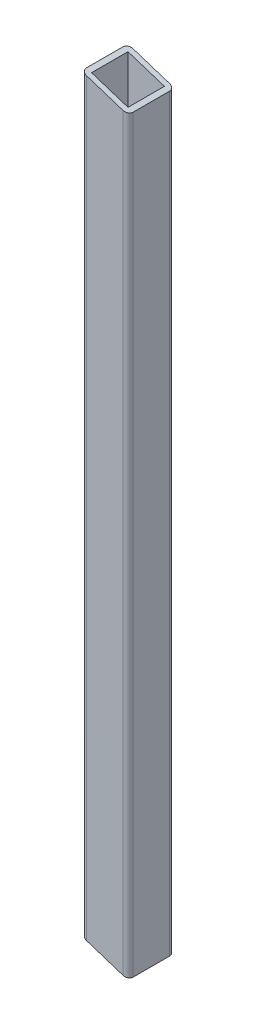
ISO-10303-21;
HEADER;
FILE_DESCRIPTION(('STEP AP214'),'2;1');
FILE_NAME('part.step','',(''),(''),'','','');
FILE_SCHEMA(('AUTOMOTIVE_DESIGN { 1 0 10303 214 1 1 1 1 }'));
ENDSEC;
DATA;
#1=APPLICATION_CONTEXT('core data for automotive mechanical design processes');
#2=APPLICATION_PROTOCOL_DEFINITION('international standard','automotive_design',2000,#1);
#3=PRODUCT_CONTEXT('',#1,'mechanical');
#4=PRODUCT('Part','Part','',(#3));
#5=PRODUCT_RELATED_PRODUCT_CATEGORY('part','',(#4));
#6=PRODUCT_DEFINITION_FORMATION('','',#4);
#7=PRODUCT_DEFINITION_CONTEXT('part definition',#1,'design');
#8=PRODUCT_DEFINITION('design','',#6,#7);
#9=PRODUCT_DEFINITION_SHAPE('','',#8);
#10=(LENGTH_UNIT() NAMED_UNIT(*) SI_UNIT(.MILLI.,.METRE.));
#11=(NAMED_UNIT(*) PLANE_ANGLE_UNIT() SI_UNIT($,.RADIAN.));
#12=(NAMED_UNIT(*) SI_UNIT($,.STERADIAN.) SOLID_ANGLE_UNIT());
#13=UNCERTAINTY_MEASURE_WITH_UNIT(LENGTH_MEASURE(1.E-05),#10,'distance_accuracy_value','');
#14=(GEOMETRIC_REPRESENTATION_CONTEXT(3) GLOBAL_UNCERTAINTY_ASSIGNED_CONTEXT((#13)) GLOBAL_UNIT_ASSIGNED_CONTEXT((#10,
#11,#12)) REPRESENTATION_CONTEXT('',''));
#15=CARTESIAN_POINT('',(0.,0.,0.));
#16=DIRECTION('',(0.,0.,1.));
#17=DIRECTION('',(1.,0.,0.));
#18=AXIS2_PLACEMENT_3D('',#15,#16,#17);
#19=CARTESIAN_POINT('',(22.8,420.,2.8));
#20=DIRECTION('',(0.,-1.,0.));
#21=DIRECTION('',(0.,0.,-1.));
#22=AXIS2_PLACEMENT_3D('',#19,#20,#21);
#23=CYLINDRICAL_SURFACE('',#22,2.8);
#24=CARTESIAN_POINT('',(22.8,412.59183092589,2.8));
#25=DIRECTION('',(0.309016994374948,0.951056516295153,0.));
#26=DIRECTION('',(0.951056516295154,-0.309016994374948,0.));
#27=AXIS2_PLACEMENT_3D('',#24,#25,#26);
#28=ELLIPSE('',#27,2.94409422786715,2.8);
#29=CARTESIAN_POINT('',(25.6,411.682055776438,2.80000000000002));
#30=VERTEX_POINT('',#29);
#31=CARTESIAN_POINT('',(22.8,412.59183092589,0.));
#32=VERTEX_POINT('',#31);
#33=EDGE_CURVE('E209',#30,#32,#28,.T.);
#34=ORIENTED_EDGE('',*,*,#33,.F.);
#35=DIRECTION('',(0.,-1.,0.));
#36=VECTOR('',#35,1.);
#37=CARTESIAN_POINT('',(25.6,420.,2.80000000000002));
#38=LINE('',#37,#36);
#39=CARTESIAN_POINT('',(25.6,0.,2.80000000000002));
#40=VERTEX_POINT('',#39);
#41=EDGE_CURVE('E145',#30,#40,#38,.T.);
#42=ORIENTED_EDGE('',*,*,#41,.T.);
#43=CARTESIAN_POINT('',(22.8,0.909775149452119,2.8));
#44=DIRECTION('',(-0.30901699437494,-0.951056516295156,0.));
#45=DIRECTION('',(0.951056516295156,-0.30901699437494,0.));
#46=AXIS2_PLACEMENT_3D('',#43,#44,#45);
#47=ELLIPSE('',#46,2.94409422786714,2.8);
#48=CARTESIAN_POINT('',(22.8,0.909775149452188,0.));
#49=VERTEX_POINT('',#48);
#50=EDGE_CURVE('E175',#49,#40,#47,.T.);
#51=ORIENTED_EDGE('',*,*,#50,.F.);
#52=DIRECTION('',(0.,-1.,0.));
#53=VECTOR('',#52,1.);
#54=CARTESIAN_POINT('',(22.8,420.,0.));
#55=LINE('',#54,#53);
#56=EDGE_CURVE('E41',#32,#49,#55,.T.);
#57=ORIENTED_EDGE('',*,*,#56,.F.);
#58=EDGE_LOOP('',(#34,#42,#51,#57));
#59=FACE_BOUND('',#58,.T.);
#60=ADVANCED_FACE('F34',(#59),#23,.T.);
#61=CARTESIAN_POINT('',(2.80000000000002,420.,0.));
#62=DIRECTION('',(0.,0.,1.));
#63=DIRECTION('',(1.,0.,0.));
#64=AXIS2_PLACEMENT_3D('',#61,#62,#63);
#65=PLANE('',#64);
#66=DIRECTION('',(-0.951056516295154,0.309016994374948,0.));
#67=VECTOR('',#66,1.);
#68=CARTESIAN_POINT('',(2.53262379212494,419.177100646791,0.));
#69=LINE('',#68,#67);
#70=CARTESIAN_POINT('',(2.80000000000002,419.090224850548,0.));
#71=VERTEX_POINT('',#70);
#72=EDGE_CURVE('E48',#32,#71,#69,.T.);
#73=ORIENTED_EDGE('',*,*,#72,.F.);
#74=ORIENTED_EDGE('',*,*,#56,.T.);
#75=DIRECTION('',(0.951056516295156,-0.30901699437494,0.));
#76=VECTOR('',#75,1.);
#77=CARTESIAN_POINT('',(-118.457696717291,46.8071830573933,0.));
#78=LINE('',#77,#76);
#79=CARTESIAN_POINT('',(2.80000000000002,7.40816907411007,0.));
#80=VERTEX_POINT('',#79);
#81=EDGE_CURVE('E166',#80,#49,#78,.T.);
#82=ORIENTED_EDGE('',*,*,#81,.F.);
#83=DIRECTION('',(0.,-1.,0.));
#84=VECTOR('',#83,1.);
#85=CARTESIAN_POINT('',(2.80000000000002,420.,0.));
#86=LINE('',#85,#84);
#87=EDGE_CURVE('E162',#71,#80,#86,.T.);
#88=ORIENTED_EDGE('',*,*,#87,.F.);
#89=EDGE_LOOP('',(#73,#74,#82,#88));
#90=FACE_BOUND('',#89,.T.);
#91=ADVANCED_FACE('F165',(#90),#65,.F.);
#92=CARTESIAN_POINT('',(2.8,420.,2.8));
#93=DIRECTION('',(0.,-1.,0.));
#94=DIRECTION('',(0.,0.,-1.));
#95=AXIS2_PLACEMENT_3D('',#92,#93,#94);
#96=CYLINDRICAL_SURFACE('',#95,2.8);
#97=CARTESIAN_POINT('',(2.8,419.090224850548,2.8));
#98=DIRECTION('',(0.309016994374948,0.951056516295153,0.));
#99=DIRECTION('',(0.951056516295154,-0.309016994374948,0.));
#100=AXIS2_PLACEMENT_3D('',#97,#98,#99);
#101=ELLIPSE('',#100,2.94409422786715,2.8);
#102=CARTESIAN_POINT('',(0.,420.,2.80000000000002));
#103=VERTEX_POINT('',#102);
#104=EDGE_CURVE('E56',#71,#103,#101,.T.);
#105=ORIENTED_EDGE('',*,*,#104,.F.);
#106=ORIENTED_EDGE('',*,*,#87,.T.);
#107=CARTESIAN_POINT('',(2.8,7.40816907411007,2.8));
#108=DIRECTION('',(-0.30901699437494,-0.951056516295156,0.));
#109=DIRECTION('',(0.951056516295156,-0.30901699437494,0.));
#110=AXIS2_PLACEMENT_3D('',#107,#108,#109);
#111=ELLIPSE('',#110,2.94409422786714,2.8);
#112=CARTESIAN_POINT('',(0.,8.31794422356219,2.80000000000002));
#113=VERTEX_POINT('',#112);
#114=EDGE_CURVE('E177',#113,#80,#111,.T.);
#115=ORIENTED_EDGE('',*,*,#114,.F.);
#116=DIRECTION('',(0.,-1.,0.));
#117=VECTOR('',#116,1.);
#118=CARTESIAN_POINT('',(0.,420.,2.80000000000002));
#119=LINE('',#118,#117);
#120=EDGE_CURVE('E132',#103,#113,#119,.T.);
#121=ORIENTED_EDGE('',*,*,#120,.F.);
#122=EDGE_LOOP('',(#105,#106,#115,#121));
#123=FACE_BOUND('',#122,.T.);
#124=ADVANCED_FACE('F256',(#123),#96,.T.);
#125=CARTESIAN_POINT('',(2.8,420.,22.8));
#126=DIRECTION('',(0.,-1.,0.));
#127=DIRECTION('',(0.,0.,-1.));
#128=AXIS2_PLACEMENT_3D('',#125,#126,#127);
#129=CYLINDRICAL_SURFACE('',#128,2.8);
#130=CARTESIAN_POINT('',(2.8,419.090224850548,22.8));
#131=DIRECTION('',(0.309016994374948,0.951056516295153,0.));
#132=DIRECTION('',(0.951056516295154,-0.309016994374948,0.));
#133=AXIS2_PLACEMENT_3D('',#130,#131,#132);
#134=ELLIPSE('',#133,2.94409422786715,2.8);
#135=CARTESIAN_POINT('',(0.,420.,22.7999999999999));
#136=VERTEX_POINT('',#135);
#137=CARTESIAN_POINT('',(2.80000000000002,419.090224850548,25.6));
#138=VERTEX_POINT('',#137);
#139=EDGE_CURVE('E137',#136,#138,#134,.T.);
#140=ORIENTED_EDGE('',*,*,#139,.F.);
#141=DIRECTION('',(0.,-1.,0.));
#142=VECTOR('',#141,1.);
#143=CARTESIAN_POINT('',(0.,420.,22.8));
#144=LINE('',#143,#142);
#145=CARTESIAN_POINT('',(0.,8.31794422356219,22.8));
#146=VERTEX_POINT('',#145);
#147=EDGE_CURVE('E123',#136,#146,#144,.T.);
#148=ORIENTED_EDGE('',*,*,#147,.T.);
#149=CARTESIAN_POINT('',(2.8,7.40816907411007,22.8));
#150=DIRECTION('',(-0.30901699437494,-0.951056516295156,0.));
#151=DIRECTION('',(0.951056516295156,-0.30901699437494,0.));
#152=AXIS2_PLACEMENT_3D('',#149,#150,#151);
#153=ELLIPSE('',#152,2.94409422786714,2.8);
#154=CARTESIAN_POINT('',(2.80000000000002,7.40816907411013,25.6));
#155=VERTEX_POINT('',#154);
#156=EDGE_CURVE('E220',#155,#146,#153,.T.);
#157=ORIENTED_EDGE('',*,*,#156,.F.);
#158=DIRECTION('',(0.,-1.,0.));
#159=VECTOR('',#158,1.);
#160=CARTESIAN_POINT('',(2.80000000000002,420.,25.6));
#161=LINE('',#160,#159);
#162=EDGE_CURVE('E133',#138,#155,#161,.T.);
#163=ORIENTED_EDGE('',*,*,#162,.F.);
#164=EDGE_LOOP('',(#140,#148,#157,#163));
#165=FACE_BOUND('',#164,.T.);
#166=ADVANCED_FACE('F138',(#165),#129,.T.);
#167=CARTESIAN_POINT('',(2.80000000000002,420.,25.6));
#168=DIRECTION('',(0.,0.,-1.));
#169=DIRECTION('',(-1.,0.,0.));
#170=AXIS2_PLACEMENT_3D('',#167,#168,#169);
#171=PLANE('',#170);
#172=DIRECTION('',(0.951056516295154,-0.309016994374948,0.));
#173=VECTOR('',#172,1.);
#174=CARTESIAN_POINT('',(2.53262379212494,419.177100646791,25.6));
#175=LINE('',#174,#173);
#176=CARTESIAN_POINT('',(22.8,412.59183092589,25.6));
#177=VERTEX_POINT('',#176);
#178=EDGE_CURVE('E141',#138,#177,#175,.T.);
#179=ORIENTED_EDGE('',*,*,#178,.F.);
#180=ORIENTED_EDGE('',*,*,#162,.T.);
#181=DIRECTION('',(-0.951056516295156,0.30901699437494,0.));
#182=VECTOR('',#181,1.);
#183=CARTESIAN_POINT('',(-118.457696717291,46.8071830573933,25.6));
#184=LINE('',#183,#182);
#185=CARTESIAN_POINT('',(22.8,0.909775149452119,25.6));
#186=VERTEX_POINT('',#185);
#187=EDGE_CURVE('E217',#186,#155,#184,.T.);
#188=ORIENTED_EDGE('',*,*,#187,.F.);
#189=DIRECTION('',(0.,-1.,0.));
#190=VECTOR('',#189,1.);
#191=CARTESIAN_POINT('',(22.8,420.,25.6));
#192=LINE('',#191,#190);
#193=EDGE_CURVE('E158',#177,#186,#192,.T.);
#194=ORIENTED_EDGE('',*,*,#193,.F.);
#195=EDGE_LOOP('',(#179,#180,#188,#194));
#196=FACE_BOUND('',#195,.T.);
#197=ADVANCED_FACE('F225',(#196),#171,.F.);
#198=CARTESIAN_POINT('',(22.8,420.,22.8));
#199=DIRECTION('',(0.,-1.,0.));
#200=DIRECTION('',(0.,0.,-1.));
#201=AXIS2_PLACEMENT_3D('',#198,#199,#200);
#202=CYLINDRICAL_SURFACE('',#201,2.8);
#203=CARTESIAN_POINT('',(22.8,412.59183092589,22.8));
#204=DIRECTION('',(0.309016994374948,0.951056516295153,0.));
#205=DIRECTION('',(0.951056516295154,-0.309016994374948,0.));
#206=AXIS2_PLACEMENT_3D('',#203,#204,#205);
#207=ELLIPSE('',#206,2.94409422786715,2.8);
#208=CARTESIAN_POINT('',(25.6,411.682055776438,22.8));
#209=VERTEX_POINT('',#208);
#210=EDGE_CURVE('E227',#177,#209,#207,.T.);
#211=ORIENTED_EDGE('',*,*,#210,.F.);
#212=ORIENTED_EDGE('',*,*,#193,.T.);
#213=CARTESIAN_POINT('',(22.8,0.909775149452119,22.8));
#214=DIRECTION('',(-0.30901699437494,-0.951056516295156,0.));
#215=DIRECTION('',(0.951056516295156,-0.30901699437494,0.));
#216=AXIS2_PLACEMENT_3D('',#213,#214,#215);
#217=ELLIPSE('',#216,2.94409422786714,2.8);
#218=CARTESIAN_POINT('',(25.6,0.,22.7999999999999));
#219=VERTEX_POINT('',#218);
#220=EDGE_CURVE('E214',#219,#186,#217,.T.);
#221=ORIENTED_EDGE('',*,*,#220,.F.);
#222=DIRECTION('',(0.,-1.,0.));
#223=VECTOR('',#222,1.);
#224=CARTESIAN_POINT('',(25.6,420.,22.8));
#225=LINE('',#224,#223);
#226=EDGE_CURVE('E148',#209,#219,#225,.T.);
#227=ORIENTED_EDGE('',*,*,#226,.F.);
#228=EDGE_LOOP('',(#211,#212,#221,#227));
#229=FACE_BOUND('',#228,.T.);
#230=ADVANCED_FACE('F239',(#229),#202,.T.);
#231=CARTESIAN_POINT('',(22.8,1040.5,2.8));
#232=DIRECTION('',(1.,0.,0.));
#233=DIRECTION('',(0.,0.,-1.));
#234=AXIS2_PLACEMENT_3D('',#231,#232,#233);
#235=PLANE('',#234);
#236=DIRECTION('',(0.,0.,1.));
#237=VECTOR('',#236,1.);
#238=CARTESIAN_POINT('',(22.8,412.59183092589,2.80000000000007));
#239=LINE('',#238,#237);
#240=CARTESIAN_POINT('',(22.8,412.59183092589,2.8));
#241=VERTEX_POINT('',#240);
#242=CARTESIAN_POINT('',(22.8,412.59183092589,22.8));
#243=VERTEX_POINT('',#242);
#244=EDGE_CURVE('E229',#241,#243,#239,.T.);
#245=ORIENTED_EDGE('',*,*,#244,.F.);
#246=DIRECTION('',(0.,-1.,0.));
#247=VECTOR('',#246,1.);
#248=CARTESIAN_POINT('',(22.8,1040.5,2.8));
#249=LINE('',#248,#247);
#250=CARTESIAN_POINT('',(22.8,0.909775149452202,2.8));
#251=VERTEX_POINT('',#250);
#252=EDGE_CURVE('E151',#241,#251,#249,.T.);
#253=ORIENTED_EDGE('',*,*,#252,.T.);
#254=DIRECTION('',(0.,0.,-1.));
#255=VECTOR('',#254,1.);
#256=CARTESIAN_POINT('',(22.8,0.90977514945223,2.80000000000012));
#257=LINE('',#256,#255);
#258=CARTESIAN_POINT('',(22.8,0.909775149452161,22.8));
#259=VERTEX_POINT('',#258);
#260=EDGE_CURVE('E207',#259,#251,#257,.T.);
#261=ORIENTED_EDGE('',*,*,#260,.F.);
#262=DIRECTION('',(0.,-1.,0.));
#263=VECTOR('',#262,1.);
#264=CARTESIAN_POINT('',(22.8,1040.5,22.8));
#265=LINE('',#264,#263);
#266=EDGE_CURVE('E154',#243,#259,#265,.T.);
#267=ORIENTED_EDGE('',*,*,#266,.F.);
#268=EDGE_LOOP('',(#245,#253,#261,#267));
#269=FACE_BOUND('',#268,.T.);
#270=ADVANCED_FACE('F241',(#269),#235,.F.);
#271=CARTESIAN_POINT('',(2.8,1040.5,2.8));
#272=DIRECTION('',(0.,0.,-1.));
#273=DIRECTION('',(-1.,0.,0.));
#274=AXIS2_PLACEMENT_3D('',#271,#272,#273);
#275=PLANE('',#274);
#276=DIRECTION('',(0.951056516295154,-0.309016994374948,0.));
#277=VECTOR('',#276,1.);
#278=CARTESIAN_POINT('',(-179.827750731615,478.429578141963,2.79999999999997));
#279=LINE('',#278,#277);
#280=CARTESIAN_POINT('',(2.8,419.090224850548,2.8));
#281=VERTEX_POINT('',#280);
#282=EDGE_CURVE('E358',#281,#241,#279,.T.);
#283=ORIENTED_EDGE('',*,*,#282,.F.);
#284=DIRECTION('',(0.,-1.,0.));
#285=VECTOR('',#284,1.);
#286=CARTESIAN_POINT('',(2.8,1040.5,2.8));
#287=LINE('',#286,#285);
#288=CARTESIAN_POINT('',(2.8,7.40816907411013,2.8));
#289=VERTEX_POINT('',#288);
#290=EDGE_CURVE('E185',#281,#289,#287,.T.);
#291=ORIENTED_EDGE('',*,*,#290,.T.);
#292=DIRECTION('',(-0.951056516295156,0.30901699437494,0.));
#293=VECTOR('',#292,1.);
#294=CARTESIAN_POINT('',(-300.818071241027,106.059660552563,2.79999999999995));
#295=LINE('',#294,#293);
#296=EDGE_CURVE('E205',#251,#289,#295,.T.);
#297=ORIENTED_EDGE('',*,*,#296,.F.);
#298=ORIENTED_EDGE('',*,*,#252,.F.);
#299=EDGE_LOOP('',(#283,#291,#297,#298));
#300=FACE_BOUND('',#299,.T.);
#301=ADVANCED_FACE('F247',(#300),#275,.F.);
#302=CARTESIAN_POINT('',(2.8,1040.5,2.8));
#303=DIRECTION('',(-1.,0.,0.));
#304=DIRECTION('',(0.,0.,1.));
#305=AXIS2_PLACEMENT_3D('',#302,#303,#304);
#306=PLANE('',#305);
#307=DIRECTION('',(0.,0.,-1.));
#308=VECTOR('',#307,1.);
#309=CARTESIAN_POINT('',(2.8,419.090224850548,2.80000000000006));
#310=LINE('',#309,#308);
#311=CARTESIAN_POINT('',(2.80000000000002,419.090224850548,22.8));
#312=VERTEX_POINT('',#311);
#313=EDGE_CURVE('E196',#312,#281,#310,.T.);
#314=ORIENTED_EDGE('',*,*,#313,.F.);
#315=DIRECTION('',(0.,-1.,0.));
#316=VECTOR('',#315,1.);
#317=CARTESIAN_POINT('',(2.8,1040.5,22.8));
#318=LINE('',#317,#316);
#319=CARTESIAN_POINT('',(2.79999999999998,7.40816907411024,22.8));
#320=VERTEX_POINT('',#319);
#321=EDGE_CURVE('E181',#312,#320,#318,.T.);
#322=ORIENTED_EDGE('',*,*,#321,.T.);
#323=DIRECTION('',(0.,0.,1.));
#324=VECTOR('',#323,1.);
#325=CARTESIAN_POINT('',(2.8,7.40816907411013,2.80000000000011));
#326=LINE('',#325,#324);
#327=EDGE_CURVE('E193',#289,#320,#326,.T.);
#328=ORIENTED_EDGE('',*,*,#327,.F.);
#329=ORIENTED_EDGE('',*,*,#290,.F.);
#330=EDGE_LOOP('',(#314,#322,#328,#329));
#331=FACE_BOUND('',#330,.T.);
#332=ADVANCED_FACE('F190',(#331),#306,.F.);
#333=CARTESIAN_POINT('',(2.8,1040.5,22.8));
#334=DIRECTION('',(0.,0.,1.));
#335=DIRECTION('',(1.,0.,0.));
#336=AXIS2_PLACEMENT_3D('',#333,#334,#335);
#337=PLANE('',#336);
#338=DIRECTION('',(-0.951056516295154,0.309016994374948,0.));
#339=VECTOR('',#338,1.);
#340=CARTESIAN_POINT('',(-179.827750731615,478.429578141963,22.8));
#341=LINE('',#340,#339);
#342=EDGE_CURVE('E361',#243,#312,#341,.T.);
#343=ORIENTED_EDGE('',*,*,#342,.F.);
#344=ORIENTED_EDGE('',*,*,#266,.T.);
#345=DIRECTION('',(0.951056516295156,-0.30901699437494,0.));
#346=VECTOR('',#345,1.);
#347=CARTESIAN_POINT('',(-300.818071241027,106.059660552563,22.7999999999999));
#348=LINE('',#347,#346);
#349=EDGE_CURVE('E11',#320,#259,#348,.T.);
#350=ORIENTED_EDGE('',*,*,#349,.F.);
#351=ORIENTED_EDGE('',*,*,#321,.F.);
#352=EDGE_LOOP('',(#343,#344,#350,#351));
#353=FACE_BOUND('',#352,.T.);
#354=ADVANCED_FACE('F199',(#353),#337,.F.);
#355=CARTESIAN_POINT('',(25.6,420.,2.80000000000002));
#356=DIRECTION('',(-1.,0.,0.));
#357=DIRECTION('',(0.,0.,1.));
#358=AXIS2_PLACEMENT_3D('',#355,#356,#357);
#359=PLANE('',#358);
#360=DIRECTION('',(0.,0.,-1.));
#361=VECTOR('',#360,1.);
#362=CARTESIAN_POINT('',(25.6,411.682055776438,578.246866391669));
#363=LINE('',#362,#361);
#364=EDGE_CURVE('E234',#209,#30,#363,.T.);
#365=ORIENTED_EDGE('',*,*,#364,.F.);
#366=ORIENTED_EDGE('',*,*,#226,.T.);
#367=DIRECTION('',(0.,0.,-1.));
#368=VECTOR('',#367,1.);
#369=CARTESIAN_POINT('',(25.6,0.,2.80000000000002));
#370=LINE('',#369,#368);
#371=EDGE_CURVE('E146',#219,#40,#370,.T.);
#372=ORIENTED_EDGE('',*,*,#371,.T.);
#373=ORIENTED_EDGE('',*,*,#41,.F.);
#374=EDGE_LOOP('',(#365,#366,#372,#373));
#375=FACE_BOUND('',#374,.T.);
#376=ADVANCED_FACE('F236',(#375),#359,.F.);
#377=CARTESIAN_POINT('',(0.,420.,2.80000000000002));
#378=DIRECTION('',(1.,0.,0.));
#379=DIRECTION('',(0.,0.,-1.));
#380=AXIS2_PLACEMENT_3D('',#377,#378,#379);
#381=PLANE('',#380);
#382=DIRECTION('',(0.,0.,-1.));
#383=VECTOR('',#382,1.);
#384=CARTESIAN_POINT('',(0.,8.31794422356219,578.246866391669));
#385=LINE('',#384,#383);
#386=EDGE_CURVE('E129',#146,#113,#385,.T.);
#387=ORIENTED_EDGE('',*,*,#386,.F.);
#388=ORIENTED_EDGE('',*,*,#147,.F.);
#389=DIRECTION('',(0.,0.,1.));
#390=VECTOR('',#389,1.);
#391=CARTESIAN_POINT('',(0.,420.,2.80000000000002));
#392=LINE('',#391,#390);
#393=EDGE_CURVE('E128',#103,#136,#392,.T.);
#394=ORIENTED_EDGE('',*,*,#393,.F.);
#395=ORIENTED_EDGE('',*,*,#120,.T.);
#396=EDGE_LOOP('',(#387,#388,#394,#395));
#397=FACE_BOUND('',#396,.T.);
#398=ADVANCED_FACE('F125',(#397),#381,.F.);
#399=CARTESIAN_POINT('',(25.6,0.,578.246866391669));
#400=DIRECTION('',(-0.30901699437494,-0.951056516295156,0.));
#401=DIRECTION('',(0.951056516295156,-0.30901699437494,0.));
#402=AXIS2_PLACEMENT_3D('',#399,#400,#401);
#403=PLANE('',#402);
#404=ORIENTED_EDGE('',*,*,#349,.T.);
#405=ORIENTED_EDGE('',*,*,#260,.T.);
#406=ORIENTED_EDGE('',*,*,#296,.T.);
#407=ORIENTED_EDGE('',*,*,#327,.T.);
#408=EDGE_LOOP('',(#404,#405,#406,#407));
#409=FACE_BOUND('',#408,.T.);
#410=ORIENTED_EDGE('',*,*,#81,.T.);
#411=ORIENTED_EDGE('',*,*,#50,.T.);
#412=ORIENTED_EDGE('',*,*,#371,.F.);
#413=ORIENTED_EDGE('',*,*,#220,.T.);
#414=ORIENTED_EDGE('',*,*,#187,.T.);
#415=ORIENTED_EDGE('',*,*,#156,.T.);
#416=ORIENTED_EDGE('',*,*,#386,.T.);
#417=ORIENTED_EDGE('',*,*,#114,.T.);
#418=EDGE_LOOP('',(#410,#411,#412,#413,#414,#415,#416,#417));
#419=FACE_BOUND('',#418,.T.);
#420=ADVANCED_FACE('F173',(#409,#419),#403,.T.);
#421=CARTESIAN_POINT('',(0.,420.,578.246866391669));
#422=DIRECTION('',(0.309016994374948,0.951056516295153,0.));
#423=DIRECTION('',(-0.951056516295154,0.309016994374948,0.));
#424=AXIS2_PLACEMENT_3D('',#421,#422,#423);
#425=PLANE('',#424);
#426=ORIENTED_EDGE('',*,*,#282,.T.);
#427=ORIENTED_EDGE('',*,*,#244,.T.);
#428=ORIENTED_EDGE('',*,*,#342,.T.);
#429=ORIENTED_EDGE('',*,*,#313,.T.);
#430=EDGE_LOOP('',(#426,#427,#428,#429));
#431=FACE_BOUND('',#430,.T.);
#432=ORIENTED_EDGE('',*,*,#364,.T.);
#433=ORIENTED_EDGE('',*,*,#33,.T.);
#434=ORIENTED_EDGE('',*,*,#72,.T.);
#435=ORIENTED_EDGE('',*,*,#104,.T.);
#436=ORIENTED_EDGE('',*,*,#393,.T.);
#437=ORIENTED_EDGE('',*,*,#139,.T.);
#438=ORIENTED_EDGE('',*,*,#178,.T.);
#439=ORIENTED_EDGE('',*,*,#210,.T.);
#440=EDGE_LOOP('',(#432,#433,#434,#435,#436,#437,#438,#439));
#441=FACE_BOUND('',#440,.T.);
#442=ADVANCED_FACE('F144',(#431,#441),#425,.T.);
#443=CLOSED_SHELL('',(#60,#91,#124,#166,#197,#230,#270,#301,#332,#354,#376,#398,#420,#442));
#444=MANIFOLD_SOLID_BREP('B2',#443);
#445=ADVANCED_BREP_SHAPE_REPRESENTATION('',(#18,#444),#14);
#446=SHAPE_DEFINITION_REPRESENTATION(#9,#445);
ENDSEC;
END-ISO-10303-21;
